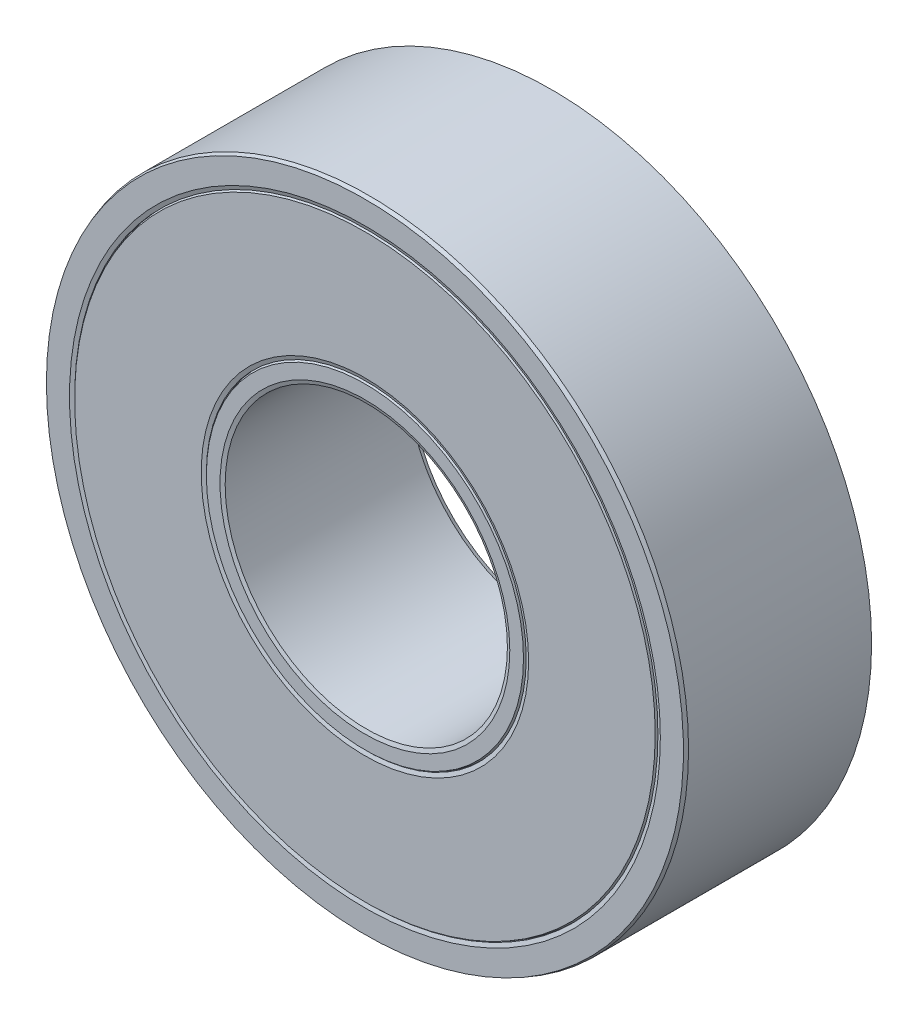
ISO-10303-21;
HEADER;
FILE_DESCRIPTION(('STEP AP214'),'2;1');
FILE_NAME('part.step','',(''),(''),'','','');
FILE_SCHEMA(('AUTOMOTIVE_DESIGN { 1 0 10303 214 1 1 1 1 }'));
ENDSEC;
DATA;
#1=APPLICATION_CONTEXT('core data for automotive mechanical design processes');
#2=APPLICATION_PROTOCOL_DEFINITION('international standard','automotive_design',2000,#1);
#3=PRODUCT_CONTEXT('',#1,'mechanical');
#4=PRODUCT('Part','Part','',(#3));
#5=PRODUCT_RELATED_PRODUCT_CATEGORY('part','',(#4));
#6=PRODUCT_DEFINITION_FORMATION('','',#4);
#7=PRODUCT_DEFINITION_CONTEXT('part definition',#1,'design');
#8=PRODUCT_DEFINITION('design','',#6,#7);
#9=PRODUCT_DEFINITION_SHAPE('','',#8);
#10=(LENGTH_UNIT() NAMED_UNIT(*) SI_UNIT(.MILLI.,.METRE.));
#11=(NAMED_UNIT(*) PLANE_ANGLE_UNIT() SI_UNIT($,.RADIAN.));
#12=(NAMED_UNIT(*) SI_UNIT($,.STERADIAN.) SOLID_ANGLE_UNIT());
#13=UNCERTAINTY_MEASURE_WITH_UNIT(LENGTH_MEASURE(1.E-05),#10,'distance_accuracy_value','');
#14=(GEOMETRIC_REPRESENTATION_CONTEXT(3) GLOBAL_UNCERTAINTY_ASSIGNED_CONTEXT((#13)) GLOBAL_UNIT_ASSIGNED_CONTEXT((#10,
#11,#12)) REPRESENTATION_CONTEXT('',''));
#15=CARTESIAN_POINT('',(0.,0.,0.));
#16=DIRECTION('',(0.,0.,1.));
#17=DIRECTION('',(1.,0.,0.));
#18=AXIS2_PLACEMENT_3D('',#15,#16,#17);
#19=CARTESIAN_POINT('',(0.,0.,0.));
#20=DIRECTION('',(0.,0.,1.));
#21=DIRECTION('',(1.,0.,0.));
#22=AXIS2_PLACEMENT_3D('',#19,#20,#21);
#23=CYLINDRICAL_SURFACE('',#22,17.);
#24=CARTESIAN_POINT('',(0.,0.,0.0727940468532393));
#25=DIRECTION('',(0.,0.,1.));
#26=DIRECTION('',(1.,0.,0.));
#27=AXIS2_PLACEMENT_3D('',#24,#25,#26);
#28=CIRCLE('',#27,17.);
#29=CARTESIAN_POINT('',(17.,0.,0.0727940468532393));
#30=VERTEX_POINT('',#29);
#31=EDGE_CURVE('E73',#30,#30,#28,.T.);
#32=ORIENTED_EDGE('',*,*,#31,.T.);
#33=EDGE_LOOP('',(#32));
#34=FACE_BOUND('',#33,.T.);
#35=CARTESIAN_POINT('',(0.,0.,9.79999999999997));
#36=DIRECTION('',(0.,0.,1.));
#37=DIRECTION('',(1.,0.,0.));
#38=AXIS2_PLACEMENT_3D('',#35,#36,#37);
#39=CIRCLE('',#38,17.);
#40=CARTESIAN_POINT('',(-17.,0.,9.79999999999997));
#41=VERTEX_POINT('',#40);
#42=EDGE_CURVE('E76',#41,#41,#39,.F.);
#43=ORIENTED_EDGE('',*,*,#42,.T.);
#44=EDGE_LOOP('',(#43));
#45=FACE_BOUND('',#44,.T.);
#46=ADVANCED_FACE('F46',(#34,#45),#23,.T.);
#47=CARTESIAN_POINT('',(0.,0.,0.));
#48=DIRECTION('',(0.,0.,1.));
#49=DIRECTION('',(1.,0.,0.));
#50=AXIS2_PLACEMENT_3D('',#47,#48,#49);
#51=PLANE('',#50);
#52=CARTESIAN_POINT('',(0.,0.,0.));
#53=DIRECTION('',(0.,0.,1.));
#54=DIRECTION('',(1.,0.,0.));
#55=AXIS2_PLACEMENT_3D('',#52,#53,#54);
#56=CIRCLE('',#55,16.8);
#57=CARTESIAN_POINT('',(16.8,0.,0.));
#58=VERTEX_POINT('',#57);
#59=EDGE_CURVE('E67',#58,#58,#56,.F.);
#60=ORIENTED_EDGE('',*,*,#59,.T.);
#61=EDGE_LOOP('',(#60));
#62=FACE_BOUND('',#61,.T.);
#63=CARTESIAN_POINT('',(0.,0.,0.));
#64=DIRECTION('',(0.,0.,1.));
#65=DIRECTION('',(1.,0.,0.));
#66=AXIS2_PLACEMENT_3D('',#63,#64,#65);
#67=CIRCLE('',#66,15.5727940468532);
#68=CARTESIAN_POINT('',(15.5727940468532,0.,0.));
#69=VERTEX_POINT('',#68);
#70=EDGE_CURVE('E70',#69,#69,#67,.T.);
#71=ORIENTED_EDGE('',*,*,#70,.T.);
#72=EDGE_LOOP('',(#71));
#73=FACE_BOUND('',#72,.T.);
#74=ADVANCED_FACE('F95',(#62,#73),#51,.F.);
#75=CARTESIAN_POINT('',(0.,0.,10.));
#76=DIRECTION('',(0.,0.,1.));
#77=DIRECTION('',(1.,0.,0.));
#78=AXIS2_PLACEMENT_3D('',#75,#76,#77);
#79=PLANE('',#78);
#80=CARTESIAN_POINT('',(0.,0.,10.));
#81=DIRECTION('',(0.,0.,1.));
#82=DIRECTION('',(1.,0.,0.));
#83=AXIS2_PLACEMENT_3D('',#80,#81,#82);
#84=CIRCLE('',#83,16.9272059531468);
#85=CARTESIAN_POINT('',(-16.9272059531468,0.,10.));
#86=VERTEX_POINT('',#85);
#87=EDGE_CURVE('E11',#86,#86,#84,.T.);
#88=ORIENTED_EDGE('',*,*,#87,.T.);
#89=EDGE_LOOP('',(#88));
#90=FACE_BOUND('',#89,.T.);
#91=CARTESIAN_POINT('',(0.,0.,10.));
#92=DIRECTION('',(0.,0.,1.));
#93=DIRECTION('',(1.,0.,0.));
#94=AXIS2_PLACEMENT_3D('',#91,#92,#93);
#95=CIRCLE('',#94,15.7);
#96=CARTESIAN_POINT('',(15.7,0.,10.));
#97=VERTEX_POINT('',#96);
#98=EDGE_CURVE('E54',#97,#97,#95,.F.);
#99=ORIENTED_EDGE('',*,*,#98,.T.);
#100=EDGE_LOOP('',(#99));
#101=FACE_BOUND('',#100,.T.);
#102=ADVANCED_FACE('F101',(#90,#101),#79,.T.);
#103=CARTESIAN_POINT('',(0.,0.,0.));
#104=DIRECTION('',(0.,0.,1.));
#105=DIRECTION('',(1.,0.,0.));
#106=AXIS2_PLACEMENT_3D('',#103,#104,#105);
#107=CYLINDRICAL_SURFACE('',#106,15.5);
#108=CARTESIAN_POINT('',(0.,0.,0.200000000000013));
#109=DIRECTION('',(0.,0.,1.));
#110=DIRECTION('',(1.,0.,0.));
#111=AXIS2_PLACEMENT_3D('',#108,#109,#110);
#112=CIRCLE('',#111,15.5);
#113=CARTESIAN_POINT('',(15.5,0.,0.200000000000013));
#114=VERTEX_POINT('',#113);
#115=EDGE_CURVE('E58',#114,#114,#112,.F.);
#116=ORIENTED_EDGE('',*,*,#115,.T.);
#117=EDGE_LOOP('',(#116));
#118=FACE_BOUND('',#117,.T.);
#119=CARTESIAN_POINT('',(0.,0.,9.92720595314676));
#120=DIRECTION('',(0.,0.,1.));
#121=DIRECTION('',(1.,0.,0.));
#122=AXIS2_PLACEMENT_3D('',#119,#120,#121);
#123=CIRCLE('',#122,15.5);
#124=CARTESIAN_POINT('',(15.5,0.,9.92720595314676));
#125=VERTEX_POINT('',#124);
#126=EDGE_CURVE('E62',#125,#125,#123,.T.);
#127=ORIENTED_EDGE('',*,*,#126,.T.);
#128=EDGE_LOOP('',(#127));
#129=FACE_BOUND('',#128,.T.);
#130=ADVANCED_FACE('F111',(#118,#129),#107,.F.);
#131=CARTESIAN_POINT('',(0.,0.,0.0727940468532393));
#132=DIRECTION('',(0.,0.,1.));
#133=DIRECTION('',(1.,0.,0.));
#134=AXIS2_PLACEMENT_3D('',#131,#132,#133);
#135=CONICAL_SURFACE('',#134,17.,1.22173047639603);
#136=ORIENTED_EDGE('',*,*,#59,.F.);
#137=EDGE_LOOP('',(#136));
#138=FACE_BOUND('',#137,.T.);
#139=ORIENTED_EDGE('',*,*,#31,.F.);
#140=EDGE_LOOP('',(#139));
#141=FACE_BOUND('',#140,.T.);
#142=ADVANCED_FACE('F90',(#138,#141),#135,.T.);
#143=CARTESIAN_POINT('',(0.,0.,0.));
#144=DIRECTION('',(0.,0.,-1.));
#145=DIRECTION('',(-1.,0.,0.));
#146=AXIS2_PLACEMENT_3D('',#143,#144,#145);
#147=CONICAL_SURFACE('',#146,15.5727940468532,0.349065850398863);
#148=ORIENTED_EDGE('',*,*,#115,.F.);
#149=EDGE_LOOP('',(#148));
#150=FACE_BOUND('',#149,.T.);
#151=ORIENTED_EDGE('',*,*,#70,.F.);
#152=EDGE_LOOP('',(#151));
#153=FACE_BOUND('',#152,.T.);
#154=ADVANCED_FACE('F84',(#150,#153),#147,.F.);
#155=CARTESIAN_POINT('',(0.,0.,10.));
#156=DIRECTION('',(0.,0.,-1.));
#157=DIRECTION('',(-1.,0.,0.));
#158=AXIS2_PLACEMENT_3D('',#155,#156,#157);
#159=CONICAL_SURFACE('',#158,16.9272059531468,0.349065850398841);
#160=CARTESIAN_POINT('',(-17.,0.,9.79999999999997));
#161=CARTESIAN_POINT('',(-16.9992417286786,0.,9.80208333333331));
#162=CARTESIAN_POINT('',(-16.9984834573572,0.,9.80416666666664));
#163=CARTESIAN_POINT('',(-16.9969669147144,0.,9.80833333333331));
#164=CARTESIAN_POINT('',(-16.9962086433931,0.,9.81041666666664));
#165=CARTESIAN_POINT('',(-16.9946921007503,0.,9.81458333333331));
#166=CARTESIAN_POINT('',(-16.9939338294289,0.,9.81666666666664));
#167=CARTESIAN_POINT('',(-16.9924172867861,0.,9.82083333333331));
#168=CARTESIAN_POINT('',(-16.9916590154647,0.,9.82291666666664));
#169=CARTESIAN_POINT('',(-16.990142472822,0.,9.82708333333331));
#170=CARTESIAN_POINT('',(-16.9893842015006,0.,9.82916666666664));
#171=CARTESIAN_POINT('',(-16.9878676588578,0.,9.83333333333331));
#172=CARTESIAN_POINT('',(-16.9871093875364,0.,9.83541666666665));
#173=CARTESIAN_POINT('',(-16.9855928448936,0.,9.83958333333331));
#174=CARTESIAN_POINT('',(-16.9848345735722,0.,9.84166666666665));
#175=CARTESIAN_POINT('',(-16.9833180309295,0.,9.84583333333331));
#176=CARTESIAN_POINT('',(-16.9825597596081,0.,9.84791666666665));
#177=CARTESIAN_POINT('',(-16.9810432169653,0.,9.85208333333331));
#178=CARTESIAN_POINT('',(-16.9802849456439,0.,9.85416666666665));
#179=CARTESIAN_POINT('',(-16.9787684030011,0.,9.85833333333331));
#180=CARTESIAN_POINT('',(-16.9780101316798,0.,9.86041666666665));
#181=CARTESIAN_POINT('',(-16.976493589037,0.,9.86458333333331));
#182=CARTESIAN_POINT('',(-16.9757353177156,0.,9.86666666666665));
#183=CARTESIAN_POINT('',(-16.9742187750728,0.,9.87083333333331));
#184=CARTESIAN_POINT('',(-16.9734605037514,0.,9.87291666666665));
#185=CARTESIAN_POINT('',(-16.9719439611086,0.,9.87708333333332));
#186=CARTESIAN_POINT('',(-16.9711856897873,0.,9.87916666666665));
#187=CARTESIAN_POINT('',(-16.9696691471445,0.,9.88333333333332));
#188=CARTESIAN_POINT('',(-16.9689108758231,0.,9.88541666666665));
#189=CARTESIAN_POINT('',(-16.9673943331803,0.,9.88958333333332));
#190=CARTESIAN_POINT('',(-16.9666360618589,0.,9.89166666666665));
#191=CARTESIAN_POINT('',(-16.9651195192162,0.,9.89583333333332));
#192=CARTESIAN_POINT('',(-16.9643612478948,0.,9.89791666666665));
#193=CARTESIAN_POINT('',(-16.962844705252,0.,9.90208333333332));
#194=CARTESIAN_POINT('',(-16.9620864339306,0.,9.90416666666665));
#195=CARTESIAN_POINT('',(-16.9605698912878,0.,9.90833333333332));
#196=CARTESIAN_POINT('',(-16.9598116199664,0.,9.91041666666665));
#197=CARTESIAN_POINT('',(-16.9582950773237,0.,9.91458333333332));
#198=CARTESIAN_POINT('',(-16.9575368060023,0.,9.91666666666666));
#199=CARTESIAN_POINT('',(-16.9560202633595,0.,9.92083333333332));
#200=CARTESIAN_POINT('',(-16.9552619920381,0.,9.92291666666666));
#201=CARTESIAN_POINT('',(-16.9537454493953,0.,9.92708333333332));
#202=CARTESIAN_POINT('',(-16.9529871780739,0.,9.92916666666666));
#203=CARTESIAN_POINT('',(-16.9514706354312,0.,9.93333333333332));
#204=CARTESIAN_POINT('',(-16.9507123641098,0.,9.93541666666666));
#205=CARTESIAN_POINT('',(-16.949195821467,0.,9.93958333333332));
#206=CARTESIAN_POINT('',(-16.9484375501456,0.,9.94166666666666));
#207=CARTESIAN_POINT('',(-16.9469210075028,0.,9.94583333333333));
#208=CARTESIAN_POINT('',(-16.9461627361815,0.,9.94791666666666));
#209=CARTESIAN_POINT('',(-16.9446461935387,0.,9.95208333333333));
#210=CARTESIAN_POINT('',(-16.9438879222173,0.,9.95416666666666));
#211=CARTESIAN_POINT('',(-16.9423713795745,0.,9.95833333333333));
#212=CARTESIAN_POINT('',(-16.9416131082531,0.,9.96041666666666));
#213=CARTESIAN_POINT('',(-16.9400965656104,0.,9.96458333333333));
#214=CARTESIAN_POINT('',(-16.939338294289,0.,9.96666666666666));
#215=CARTESIAN_POINT('',(-16.9378217516462,0.,9.97083333333333));
#216=CARTESIAN_POINT('',(-16.9370634803248,0.,9.97291666666666));
#217=CARTESIAN_POINT('',(-16.935546937682,0.,9.97708333333333));
#218=CARTESIAN_POINT('',(-16.9347886663606,0.,9.97916666666666));
#219=CARTESIAN_POINT('',(-16.9332721237179,0.,9.98333333333333));
#220=CARTESIAN_POINT('',(-16.9325138523965,0.,9.98541666666667));
#221=CARTESIAN_POINT('',(-16.9309973097537,0.,9.98958333333333));
#222=CARTESIAN_POINT('',(-16.9302390384323,0.,9.99166666666667));
#223=CARTESIAN_POINT('',(-16.9287224957895,0.,9.99583333333333));
#224=CARTESIAN_POINT('',(-16.9279642244681,0.,9.99791666666667));
#225=CARTESIAN_POINT('',(-16.9272059531468,0.,10.));
#226=B_SPLINE_CURVE_WITH_KNOTS('',3,(#160,#161,#162,#163,#164,#165,#166,#167,#168,#169,#170,
#171,#172,#173,#174,#175,#176,#177,#178,#179,#180,#181,#182,#183,#184,#185,#186,#187,#188,#189,
#190,#191,#192,#193,#194,#195,#196,#197,#198,#199,#200,#201,#202,#203,#204,#205,#206,#207,#208,
#209,#210,#211,#212,#213,#214,#215,#216,#217,#218,#219,#220,#221,#222,#223,#224,#225),
.UNSPECIFIED.,.F.,.F.,(4,2,2,2,2,2,2,2,2,2,2,2,2,2,2,2,2,2,2,2,2,2,2,2,2,2,2,2,2,2,2,2,4),(0.,
0.0066511110779737,0.013302222155949,0.0199533332339244,0.0266044443118997,0.0332555553898762,
0.0399066664678515,0.0465577775458269,0.0532088886238022,0.0598599997017759,0.0665111107797512,
0.0731622218577265,0.0798133329357019,0.0864644440136784,0.0931155550916537,0.099766666169629,
0.106417777247604,0.113068888325578,0.119719999403553,0.126371110481529,0.133022221559504,
0.139673332637481,0.146324443715456,0.152975554793431,0.159626665871407,0.16627777694938,
0.172928888027356,0.179579999105331,0.186231110183306,0.192882221261283,0.199533332339258,
0.206184443417233,0.212835554495209),.UNSPECIFIED.);
#227=EDGE_CURVE('BSEAM81',#41,#86,#226,.T.);
#228=ORIENTED_EDGE('',*,*,#42,.F.);
#229=ORIENTED_EDGE('',*,*,#87,.F.);
#230=ORIENTED_EDGE('',*,*,#227,.T.);
#231=ORIENTED_EDGE('',*,*,#227,.F.);
#232=EDGE_LOOP('',(#228,#230,#229,#231));
#233=FACE_BOUND('',#232,.T.);
#234=ADVANCED_FACE('F81',(#233),#159,.T.);
#235=CARTESIAN_POINT('',(0.,0.,9.92720595314676));
#236=DIRECTION('',(0.,0.,1.));
#237=DIRECTION('',(1.,0.,0.));
#238=AXIS2_PLACEMENT_3D('',#235,#236,#237);
#239=CONICAL_SURFACE('',#238,15.5,1.22173047639603);
#240=ORIENTED_EDGE('',*,*,#98,.F.);
#241=EDGE_LOOP('',(#240));
#242=FACE_BOUND('',#241,.T.);
#243=ORIENTED_EDGE('',*,*,#126,.F.);
#244=EDGE_LOOP('',(#243));
#245=FACE_BOUND('',#244,.T.);
#246=ADVANCED_FACE('F49',(#242,#245),#239,.F.);
#247=CLOSED_SHELL('',(#46,#74,#102,#130,#142,#154,#234,#246));
#248=MANIFOLD_SOLID_BREP('B2',#247);
#249=CARTESIAN_POINT('',(0.,0.,0.));
#250=DIRECTION('',(0.,0.,1.));
#251=DIRECTION('',(1.,0.,0.));
#252=AXIS2_PLACEMENT_3D('',#249,#250,#251);
#253=CYLINDRICAL_SURFACE('',#252,15.5);
#254=CARTESIAN_POINT('',(0.,0.,0.0727940468532411));
#255=DIRECTION('',(0.,0.,1.));
#256=DIRECTION('',(1.,0.,0.));
#257=AXIS2_PLACEMENT_3D('',#254,#255,#256);
#258=CIRCLE('',#257,15.5);
#259=CARTESIAN_POINT('',(15.5,0.,0.0727940468532411));
#260=VERTEX_POINT('',#259);
#261=EDGE_CURVE('E216',#260,#260,#258,.T.);
#262=ORIENTED_EDGE('',*,*,#261,.T.);
#263=EDGE_LOOP('',(#262));
#264=FACE_BOUND('',#263,.T.);
#265=CARTESIAN_POINT('',(0.,0.,9.80000000000001));
#266=DIRECTION('',(0.,0.,1.));
#267=DIRECTION('',(1.,0.,0.));
#268=AXIS2_PLACEMENT_3D('',#265,#266,#267);
#269=CIRCLE('',#268,15.5);
#270=CARTESIAN_POINT('',(15.5,0.,9.80000000000001));
#271=VERTEX_POINT('',#270);
#272=EDGE_CURVE('E219',#271,#271,#269,.F.);
#273=ORIENTED_EDGE('',*,*,#272,.T.);
#274=EDGE_LOOP('',(#273));
#275=FACE_BOUND('',#274,.T.);
#276=ADVANCED_FACE('F189',(#264,#275),#253,.T.);
#277=CARTESIAN_POINT('',(0.,0.,0.));
#278=DIRECTION('',(0.,0.,1.));
#279=DIRECTION('',(1.,0.,0.));
#280=AXIS2_PLACEMENT_3D('',#277,#278,#279);
#281=PLANE('',#280);
#282=CARTESIAN_POINT('',(0.,0.,0.));
#283=DIRECTION('',(0.,0.,1.));
#284=DIRECTION('',(1.,0.,0.));
#285=AXIS2_PLACEMENT_3D('',#282,#283,#284);
#286=CIRCLE('',#285,15.3);
#287=CARTESIAN_POINT('',(15.3,0.,0.));
#288=VERTEX_POINT('',#287);
#289=EDGE_CURVE('E210',#288,#288,#286,.F.);
#290=ORIENTED_EDGE('',*,*,#289,.T.);
#291=EDGE_LOOP('',(#290));
#292=FACE_BOUND('',#291,.T.);
#293=CARTESIAN_POINT('',(0.,0.,0.));
#294=DIRECTION('',(0.,0.,1.));
#295=DIRECTION('',(1.,0.,0.));
#296=AXIS2_PLACEMENT_3D('',#293,#294,#295);
#297=CIRCLE('',#296,8.57279404685324);
#298=CARTESIAN_POINT('',(8.57279404685324,0.,0.));
#299=VERTEX_POINT('',#298);
#300=EDGE_CURVE('E213',#299,#299,#297,.T.);
#301=ORIENTED_EDGE('',*,*,#300,.T.);
#302=EDGE_LOOP('',(#301));
#303=FACE_BOUND('',#302,.T.);
#304=ADVANCED_FACE('F238',(#292,#303),#281,.F.);
#305=CARTESIAN_POINT('',(0.,0.,10.));
#306=DIRECTION('',(0.,0.,1.));
#307=DIRECTION('',(1.,0.,0.));
#308=AXIS2_PLACEMENT_3D('',#305,#306,#307);
#309=PLANE('',#308);
#310=CARTESIAN_POINT('',(0.,0.,10.));
#311=DIRECTION('',(0.,0.,1.));
#312=DIRECTION('',(1.,0.,0.));
#313=AXIS2_PLACEMENT_3D('',#310,#311,#312);
#314=CIRCLE('',#313,15.4272059531468);
#315=CARTESIAN_POINT('',(15.4272059531468,0.,10.));
#316=VERTEX_POINT('',#315);
#317=EDGE_CURVE('E45',#316,#316,#314,.T.);
#318=ORIENTED_EDGE('',*,*,#317,.T.);
#319=EDGE_LOOP('',(#318));
#320=FACE_BOUND('',#319,.T.);
#321=CARTESIAN_POINT('',(0.,0.,10.));
#322=DIRECTION('',(0.,0.,1.));
#323=DIRECTION('',(1.,0.,0.));
#324=AXIS2_PLACEMENT_3D('',#321,#322,#323);
#325=CIRCLE('',#324,8.69999999999999);
#326=CARTESIAN_POINT('',(8.69999999999999,0.,10.));
#327=VERTEX_POINT('',#326);
#328=EDGE_CURVE('E197',#327,#327,#325,.F.);
#329=ORIENTED_EDGE('',*,*,#328,.T.);
#330=EDGE_LOOP('',(#329));
#331=FACE_BOUND('',#330,.T.);
#332=ADVANCED_FACE('F244',(#320,#331),#309,.T.);
#333=CARTESIAN_POINT('',(0.,0.,0.));
#334=DIRECTION('',(0.,0.,1.));
#335=DIRECTION('',(1.,0.,0.));
#336=AXIS2_PLACEMENT_3D('',#333,#334,#335);
#337=CYLINDRICAL_SURFACE('',#336,8.5);
#338=CARTESIAN_POINT('',(0.,0.,0.199999999999995));
#339=DIRECTION('',(0.,0.,1.));
#340=DIRECTION('',(1.,0.,0.));
#341=AXIS2_PLACEMENT_3D('',#338,#339,#340);
#342=CIRCLE('',#341,8.5);
#343=CARTESIAN_POINT('',(8.5,0.,0.199999999999995));
#344=VERTEX_POINT('',#343);
#345=EDGE_CURVE('E201',#344,#344,#342,.F.);
#346=ORIENTED_EDGE('',*,*,#345,.T.);
#347=EDGE_LOOP('',(#346));
#348=FACE_BOUND('',#347,.T.);
#349=CARTESIAN_POINT('',(0.,0.,9.92720595314676));
#350=DIRECTION('',(0.,0.,1.));
#351=DIRECTION('',(1.,0.,0.));
#352=AXIS2_PLACEMENT_3D('',#349,#350,#351);
#353=CIRCLE('',#352,8.5);
#354=CARTESIAN_POINT('',(8.5,0.,9.92720595314676));
#355=VERTEX_POINT('',#354);
#356=EDGE_CURVE('E205',#355,#355,#353,.T.);
#357=ORIENTED_EDGE('',*,*,#356,.T.);
#358=EDGE_LOOP('',(#357));
#359=FACE_BOUND('',#358,.T.);
#360=ADVANCED_FACE('F254',(#348,#359),#337,.F.);
#361=CARTESIAN_POINT('',(0.,0.,0.0727940468532411));
#362=DIRECTION('',(0.,0.,1.));
#363=DIRECTION('',(1.,0.,0.));
#364=AXIS2_PLACEMENT_3D('',#361,#362,#363);
#365=CONICAL_SURFACE('',#364,15.5,1.22173047639603);
#366=ORIENTED_EDGE('',*,*,#289,.F.);
#367=EDGE_LOOP('',(#366));
#368=FACE_BOUND('',#367,.T.);
#369=ORIENTED_EDGE('',*,*,#261,.F.);
#370=EDGE_LOOP('',(#369));
#371=FACE_BOUND('',#370,.T.);
#372=ADVANCED_FACE('F233',(#368,#371),#365,.T.);
#373=CARTESIAN_POINT('',(0.,0.,0.));
#374=DIRECTION('',(0.,0.,-1.));
#375=DIRECTION('',(-1.,0.,0.));
#376=AXIS2_PLACEMENT_3D('',#373,#374,#375);
#377=CONICAL_SURFACE('',#376,8.57279404685324,0.349065850398876);
#378=ORIENTED_EDGE('',*,*,#345,.F.);
#379=EDGE_LOOP('',(#378));
#380=FACE_BOUND('',#379,.T.);
#381=ORIENTED_EDGE('',*,*,#300,.F.);
#382=EDGE_LOOP('',(#381));
#383=FACE_BOUND('',#382,.T.);
#384=ADVANCED_FACE('F227',(#380,#383),#377,.F.);
#385=CARTESIAN_POINT('',(0.,0.,10.));
#386=DIRECTION('',(0.,0.,-1.));
#387=DIRECTION('',(-1.,0.,0.));
#388=AXIS2_PLACEMENT_3D('',#385,#386,#387);
#389=CONICAL_SURFACE('',#388,15.4272059531468,0.349065850398874);
#390=ORIENTED_EDGE('',*,*,#272,.F.);
#391=EDGE_LOOP('',(#390));
#392=FACE_BOUND('',#391,.T.);
#393=ORIENTED_EDGE('',*,*,#317,.F.);
#394=EDGE_LOOP('',(#393));
#395=FACE_BOUND('',#394,.T.);
#396=ADVANCED_FACE('F224',(#392,#395),#389,.T.);
#397=CARTESIAN_POINT('',(0.,0.,9.92720595314676));
#398=DIRECTION('',(0.,0.,1.));
#399=DIRECTION('',(1.,0.,0.));
#400=AXIS2_PLACEMENT_3D('',#397,#398,#399);
#401=CONICAL_SURFACE('',#400,8.5,1.22173047639603);
#402=ORIENTED_EDGE('',*,*,#328,.F.);
#403=EDGE_LOOP('',(#402));
#404=FACE_BOUND('',#403,.T.);
#405=ORIENTED_EDGE('',*,*,#356,.F.);
#406=EDGE_LOOP('',(#405));
#407=FACE_BOUND('',#406,.T.);
#408=ADVANCED_FACE('F192',(#404,#407),#401,.F.);
#409=CLOSED_SHELL('',(#276,#304,#332,#360,#372,#384,#396,#408));
#410=MANIFOLD_SOLID_BREP('B6',#409);
#411=CARTESIAN_POINT('',(0.,0.,10.));
#412=DIRECTION('',(0.,0.,1.));
#413=DIRECTION('',(1.,0.,0.));
#414=AXIS2_PLACEMENT_3D('',#411,#412,#413);
#415=PLANE('',#414);
#416=CARTESIAN_POINT('',(0.,0.,10.));
#417=DIRECTION('',(0.,0.,1.));
#418=DIRECTION('',(1.,0.,0.));
#419=AXIS2_PLACEMENT_3D('',#416,#417,#418);
#420=CIRCLE('',#419,7.69999999999999);
#421=CARTESIAN_POINT('',(7.69999999999999,0.,10.));
#422=VERTEX_POINT('',#421);
#423=EDGE_CURVE('E188',#422,#422,#420,.F.);
#424=ORIENTED_EDGE('',*,*,#423,.T.);
#425=EDGE_LOOP('',(#424));
#426=FACE_BOUND('',#425,.T.);
#427=CARTESIAN_POINT('',(0.,0.,10.));
#428=DIRECTION('',(0.,0.,1.));
#429=DIRECTION('',(1.,0.,0.));
#430=AXIS2_PLACEMENT_3D('',#427,#428,#429);
#431=CIRCLE('',#430,8.42720595314676);
#432=CARTESIAN_POINT('',(8.42720595314676,0.,10.));
#433=VERTEX_POINT('',#432);
#434=EDGE_CURVE('E331',#433,#433,#431,.T.);
#435=ORIENTED_EDGE('',*,*,#434,.T.);
#436=EDGE_LOOP('',(#435));
#437=FACE_BOUND('',#436,.T.);
#438=ADVANCED_FACE('F323',(#426,#437),#415,.T.);
#439=CARTESIAN_POINT('',(0.,0.,0.));
#440=DIRECTION('',(0.,0.,1.));
#441=DIRECTION('',(1.,0.,0.));
#442=AXIS2_PLACEMENT_3D('',#439,#440,#441);
#443=PLANE('',#442);
#444=CARTESIAN_POINT('',(0.,0.,0.));
#445=DIRECTION('',(0.,0.,1.));
#446=DIRECTION('',(1.,0.,0.));
#447=AXIS2_PLACEMENT_3D('',#444,#445,#446);
#448=CIRCLE('',#447,7.57279404685324);
#449=CARTESIAN_POINT('',(7.57279404685324,0.,0.));
#450=VERTEX_POINT('',#449);
#451=EDGE_CURVE('E350',#450,#450,#448,.T.);
#452=ORIENTED_EDGE('',*,*,#451,.T.);
#453=EDGE_LOOP('',(#452));
#454=FACE_BOUND('',#453,.T.);
#455=CARTESIAN_POINT('',(0.,0.,0.));
#456=DIRECTION('',(0.,0.,1.));
#457=DIRECTION('',(1.,0.,0.));
#458=AXIS2_PLACEMENT_3D('',#455,#456,#457);
#459=CIRCLE('',#458,8.3);
#460=CARTESIAN_POINT('',(8.3,0.,0.));
#461=VERTEX_POINT('',#460);
#462=EDGE_CURVE('E353',#461,#461,#459,.F.);
#463=ORIENTED_EDGE('',*,*,#462,.T.);
#464=EDGE_LOOP('',(#463));
#465=FACE_BOUND('',#464,.T.);
#466=ADVANCED_FACE('F357',(#454,#465),#443,.F.);
#467=CARTESIAN_POINT('',(0.,0.,10.));
#468=DIRECTION('',(0.,0.,-1.));
#469=DIRECTION('',(-1.,0.,0.));
#470=AXIS2_PLACEMENT_3D('',#467,#468,#469);
#471=CYLINDRICAL_SURFACE('',#470,8.5);
#472=CARTESIAN_POINT('',(0.,0.,0.0727940468532393));
#473=DIRECTION('',(0.,0.,1.));
#474=DIRECTION('',(1.,0.,0.));
#475=AXIS2_PLACEMENT_3D('',#472,#473,#474);
#476=CIRCLE('',#475,8.5);
#477=CARTESIAN_POINT('',(8.5,0.,0.0727940468532393));
#478=VERTEX_POINT('',#477);
#479=EDGE_CURVE('E335',#478,#478,#476,.T.);
#480=ORIENTED_EDGE('',*,*,#479,.T.);
#481=EDGE_LOOP('',(#480));
#482=FACE_BOUND('',#481,.T.);
#483=CARTESIAN_POINT('',(0.,0.,9.8));
#484=DIRECTION('',(0.,0.,1.));
#485=DIRECTION('',(1.,0.,0.));
#486=AXIS2_PLACEMENT_3D('',#483,#484,#485);
#487=CIRCLE('',#486,8.5);
#488=CARTESIAN_POINT('',(8.5,0.,9.8));
#489=VERTEX_POINT('',#488);
#490=EDGE_CURVE('E339',#489,#489,#487,.F.);
#491=ORIENTED_EDGE('',*,*,#490,.T.);
#492=EDGE_LOOP('',(#491));
#493=FACE_BOUND('',#492,.T.);
#494=ADVANCED_FACE('F367',(#482,#493),#471,.T.);
#495=CARTESIAN_POINT('',(0.,0.,10.));
#496=DIRECTION('',(0.,0.,-1.));
#497=DIRECTION('',(-1.,0.,0.));
#498=AXIS2_PLACEMENT_3D('',#495,#496,#497);
#499=CYLINDRICAL_SURFACE('',#498,7.5);
#500=CARTESIAN_POINT('',(0.,0.,0.200000000000006));
#501=DIRECTION('',(0.,0.,1.));
#502=DIRECTION('',(1.,0.,0.));
#503=AXIS2_PLACEMENT_3D('',#500,#501,#502);
#504=CIRCLE('',#503,7.5);
#505=CARTESIAN_POINT('',(7.5,0.,0.200000000000006));
#506=VERTEX_POINT('',#505);
#507=EDGE_CURVE('E344',#506,#506,#504,.F.);
#508=ORIENTED_EDGE('',*,*,#507,.T.);
#509=EDGE_LOOP('',(#508));
#510=FACE_BOUND('',#509,.T.);
#511=CARTESIAN_POINT('',(0.,0.,9.92720595314676));
#512=DIRECTION('',(0.,0.,1.));
#513=DIRECTION('',(1.,0.,0.));
#514=AXIS2_PLACEMENT_3D('',#511,#512,#513);
#515=CIRCLE('',#514,7.5);
#516=CARTESIAN_POINT('',(7.5,0.,9.92720595314676));
#517=VERTEX_POINT('',#516);
#518=EDGE_CURVE('E347',#517,#517,#515,.T.);
#519=ORIENTED_EDGE('',*,*,#518,.T.);
#520=EDGE_LOOP('',(#519));
#521=FACE_BOUND('',#520,.T.);
#522=ADVANCED_FACE('F370',(#510,#521),#499,.F.);
#523=CARTESIAN_POINT('',(0.,0.,0.));
#524=DIRECTION('',(0.,0.,-1.));
#525=DIRECTION('',(-1.,0.,0.));
#526=AXIS2_PLACEMENT_3D('',#523,#524,#525);
#527=CONICAL_SURFACE('',#526,7.57279404685324,0.349065850398863);
#528=ORIENTED_EDGE('',*,*,#507,.F.);
#529=EDGE_LOOP('',(#528));
#530=FACE_BOUND('',#529,.T.);
#531=ORIENTED_EDGE('',*,*,#451,.F.);
#532=EDGE_LOOP('',(#531));
#533=FACE_BOUND('',#532,.T.);
#534=ADVANCED_FACE('F363',(#530,#533),#527,.F.);
#535=CARTESIAN_POINT('',(0.,0.,0.0727940468532393));
#536=DIRECTION('',(0.,0.,1.));
#537=DIRECTION('',(1.,0.,0.));
#538=AXIS2_PLACEMENT_3D('',#535,#536,#537);
#539=CONICAL_SURFACE('',#538,8.5,1.22173047639603);
#540=ORIENTED_EDGE('',*,*,#462,.F.);
#541=EDGE_LOOP('',(#540));
#542=FACE_BOUND('',#541,.T.);
#543=ORIENTED_EDGE('',*,*,#479,.F.);
#544=EDGE_LOOP('',(#543));
#545=FACE_BOUND('',#544,.T.);
#546=ADVANCED_FACE('F359',(#542,#545),#539,.T.);
#547=CARTESIAN_POINT('',(0.,0.,9.92720595314676));
#548=DIRECTION('',(0.,0.,1.));
#549=DIRECTION('',(1.,0.,0.));
#550=AXIS2_PLACEMENT_3D('',#547,#548,#549);
#551=CONICAL_SURFACE('',#550,7.5,1.22173047639604);
#552=ORIENTED_EDGE('',*,*,#423,.F.);
#553=EDGE_LOOP('',(#552));
#554=FACE_BOUND('',#553,.T.);
#555=ORIENTED_EDGE('',*,*,#518,.F.);
#556=EDGE_LOOP('',(#555));
#557=FACE_BOUND('',#556,.T.);
#558=ADVANCED_FACE('F362',(#554,#557),#551,.F.);
#559=CARTESIAN_POINT('',(0.,0.,10.));
#560=DIRECTION('',(0.,0.,-1.));
#561=DIRECTION('',(-1.,0.,0.));
#562=AXIS2_PLACEMENT_3D('',#559,#560,#561);
#563=CONICAL_SURFACE('',#562,8.42720595314676,0.349065850398853);
#564=ORIENTED_EDGE('',*,*,#490,.F.);
#565=EDGE_LOOP('',(#564));
#566=FACE_BOUND('',#565,.T.);
#567=ORIENTED_EDGE('',*,*,#434,.F.);
#568=EDGE_LOOP('',(#567));
#569=FACE_BOUND('',#568,.T.);
#570=ADVANCED_FACE('F326',(#566,#569),#563,.T.);
#571=CLOSED_SHELL('',(#438,#466,#494,#522,#534,#546,#558,#570));
#572=MANIFOLD_SOLID_BREP('B40',#571);
#573=ADVANCED_BREP_SHAPE_REPRESENTATION('',(#18,#248,#410,#572),#14);
#574=SHAPE_DEFINITION_REPRESENTATION(#9,#573);
ENDSEC;
END-ISO-10303-21;
